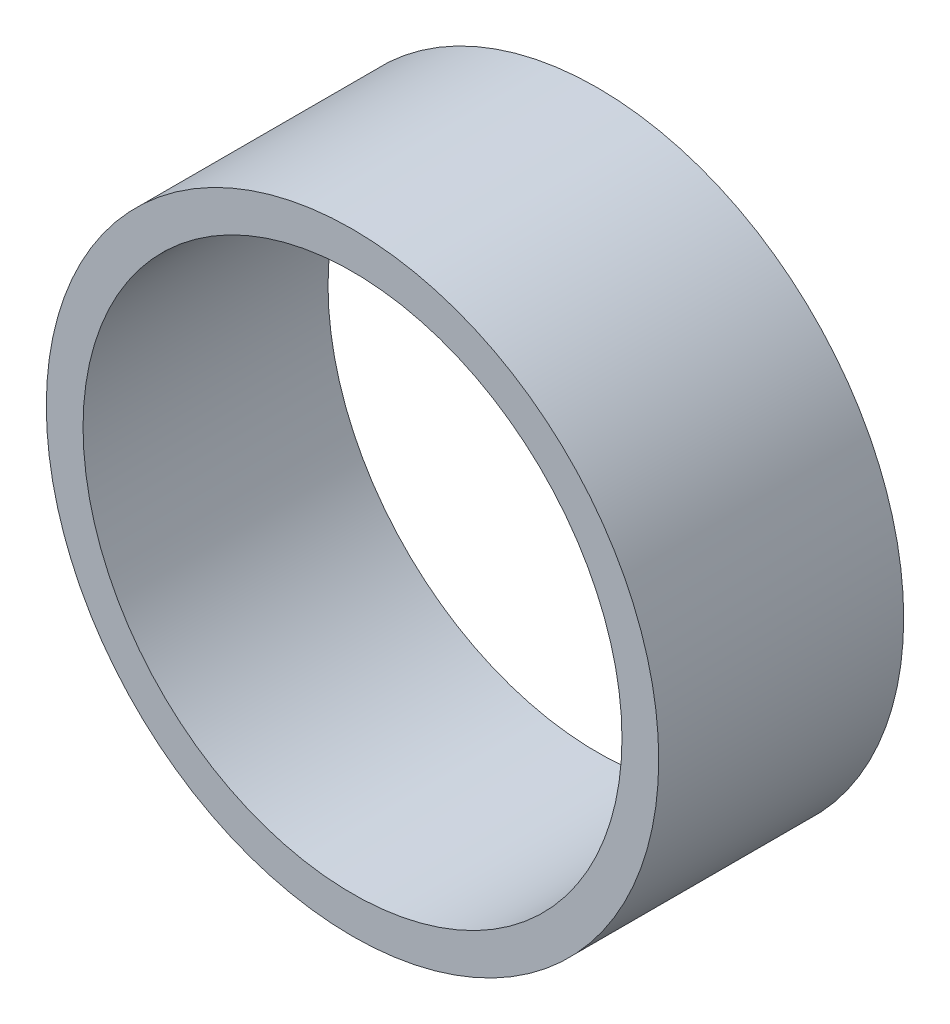
ISO-10303-21;
HEADER;
FILE_DESCRIPTION(('STEP AP214'),'2;1');
FILE_NAME('part.step','',(''),(''),'','','');
FILE_SCHEMA(('AUTOMOTIVE_DESIGN { 1 0 10303 214 1 1 1 1 }'));
ENDSEC;
DATA;
#1=APPLICATION_CONTEXT('core data for automotive mechanical design processes');
#2=APPLICATION_PROTOCOL_DEFINITION('international standard','automotive_design',2000,#1);
#3=PRODUCT_CONTEXT('',#1,'mechanical');
#4=PRODUCT('Part','Part','',(#3));
#5=PRODUCT_RELATED_PRODUCT_CATEGORY('part','',(#4));
#6=PRODUCT_DEFINITION_FORMATION('','',#4);
#7=PRODUCT_DEFINITION_CONTEXT('part definition',#1,'design');
#8=PRODUCT_DEFINITION('design','',#6,#7);
#9=PRODUCT_DEFINITION_SHAPE('','',#8);
#10=(LENGTH_UNIT() NAMED_UNIT(*) SI_UNIT(.MILLI.,.METRE.));
#11=(NAMED_UNIT(*) PLANE_ANGLE_UNIT() SI_UNIT($,.RADIAN.));
#12=(NAMED_UNIT(*) SI_UNIT($,.STERADIAN.) SOLID_ANGLE_UNIT());
#13=UNCERTAINTY_MEASURE_WITH_UNIT(LENGTH_MEASURE(1.E-05),#10,'distance_accuracy_value','');
#14=(GEOMETRIC_REPRESENTATION_CONTEXT(3) GLOBAL_UNCERTAINTY_ASSIGNED_CONTEXT((#13)) GLOBAL_UNIT_ASSIGNED_CONTEXT((#10,
#11,#12)) REPRESENTATION_CONTEXT('',''));
#15=CARTESIAN_POINT('',(0.,0.,0.));
#16=DIRECTION('',(0.,0.,1.));
#17=DIRECTION('',(1.,0.,0.));
#18=AXIS2_PLACEMENT_3D('',#15,#16,#17);
#19=CARTESIAN_POINT('',(0.,0.,20.));
#20=DIRECTION('',(0.,0.,-1.));
#21=DIRECTION('',(-1.,0.,0.));
#22=AXIS2_PLACEMENT_3D('',#19,#20,#21);
#23=CYLINDRICAL_SURFACE('',#22,25.);
#24=CARTESIAN_POINT('',(0.,0.,20.));
#25=DIRECTION('',(0.,0.,1.));
#26=DIRECTION('',(1.,0.,0.));
#27=AXIS2_PLACEMENT_3D('',#24,#25,#26);
#28=CIRCLE('',#27,25.);
#29=CARTESIAN_POINT('',(25.,0.,20.));
#30=VERTEX_POINT('',#29);
#31=EDGE_CURVE('E10',#30,#30,#28,.T.);
#32=ORIENTED_EDGE('',*,*,#31,.F.);
#33=EDGE_LOOP('',(#32));
#34=FACE_BOUND('',#33,.T.);
#35=CARTESIAN_POINT('',(0.,0.,0.));
#36=DIRECTION('',(0.,0.,1.));
#37=DIRECTION('',(1.,0.,0.));
#38=AXIS2_PLACEMENT_3D('',#35,#36,#37);
#39=CIRCLE('',#38,25.);
#40=CARTESIAN_POINT('',(25.,0.,0.));
#41=VERTEX_POINT('',#40);
#42=EDGE_CURVE('E34',#41,#41,#39,.T.);
#43=ORIENTED_EDGE('',*,*,#42,.T.);
#44=EDGE_LOOP('',(#43));
#45=FACE_BOUND('',#44,.T.);
#46=ADVANCED_FACE('F31',(#34,#45),#23,.T.);
#47=CARTESIAN_POINT('',(0.,0.,20.));
#48=DIRECTION('',(0.,0.,1.));
#49=DIRECTION('',(1.,0.,0.));
#50=AXIS2_PLACEMENT_3D('',#47,#48,#49);
#51=PLANE('',#50);
#52=CARTESIAN_POINT('',(0.,0.,20.));
#53=DIRECTION('',(0.,0.,1.));
#54=DIRECTION('',(1.,0.,0.));
#55=AXIS2_PLACEMENT_3D('',#52,#53,#54);
#56=CIRCLE('',#55,22.);
#57=CARTESIAN_POINT('',(22.,0.,20.));
#58=VERTEX_POINT('',#57);
#59=EDGE_CURVE('E43',#58,#58,#56,.T.);
#60=ORIENTED_EDGE('',*,*,#59,.F.);
#61=EDGE_LOOP('',(#60));
#62=FACE_BOUND('',#61,.T.);
#63=ORIENTED_EDGE('',*,*,#31,.T.);
#64=EDGE_LOOP('',(#63));
#65=FACE_BOUND('',#64,.T.);
#66=ADVANCED_FACE('F58',(#62,#65),#51,.T.);
#67=CARTESIAN_POINT('',(0.,0.,0.));
#68=DIRECTION('',(0.,0.,1.));
#69=DIRECTION('',(1.,0.,0.));
#70=AXIS2_PLACEMENT_3D('',#67,#68,#69);
#71=PLANE('',#70);
#72=CARTESIAN_POINT('',(0.,0.,0.));
#73=DIRECTION('',(0.,0.,1.));
#74=DIRECTION('',(1.,0.,0.));
#75=AXIS2_PLACEMENT_3D('',#72,#73,#74);
#76=CIRCLE('',#75,22.);
#77=CARTESIAN_POINT('',(22.,0.,0.));
#78=VERTEX_POINT('',#77);
#79=EDGE_CURVE('E41',#78,#78,#76,.T.);
#80=ORIENTED_EDGE('',*,*,#79,.T.);
#81=EDGE_LOOP('',(#80));
#82=FACE_BOUND('',#81,.T.);
#83=ORIENTED_EDGE('',*,*,#42,.F.);
#84=EDGE_LOOP('',(#83));
#85=FACE_BOUND('',#84,.T.);
#86=ADVANCED_FACE('F49',(#82,#85),#71,.F.);
#87=CARTESIAN_POINT('',(0.,0.,0.));
#88=DIRECTION('',(0.,0.,1.));
#89=DIRECTION('',(1.,0.,0.));
#90=AXIS2_PLACEMENT_3D('',#87,#88,#89);
#91=CYLINDRICAL_SURFACE('',#90,22.);
#92=ORIENTED_EDGE('',*,*,#79,.F.);
#93=EDGE_LOOP('',(#92));
#94=FACE_BOUND('',#93,.T.);
#95=ORIENTED_EDGE('',*,*,#59,.T.);
#96=EDGE_LOOP('',(#95));
#97=FACE_BOUND('',#96,.T.);
#98=ADVANCED_FACE('F52',(#94,#97),#91,.F.);
#99=CLOSED_SHELL('',(#46,#66,#86,#98));
#100=MANIFOLD_SOLID_BREP('B2',#99);
#101=ADVANCED_BREP_SHAPE_REPRESENTATION('',(#18,#100),#14);
#102=SHAPE_DEFINITION_REPRESENTATION(#9,#101);
ENDSEC;
END-ISO-10303-21;
